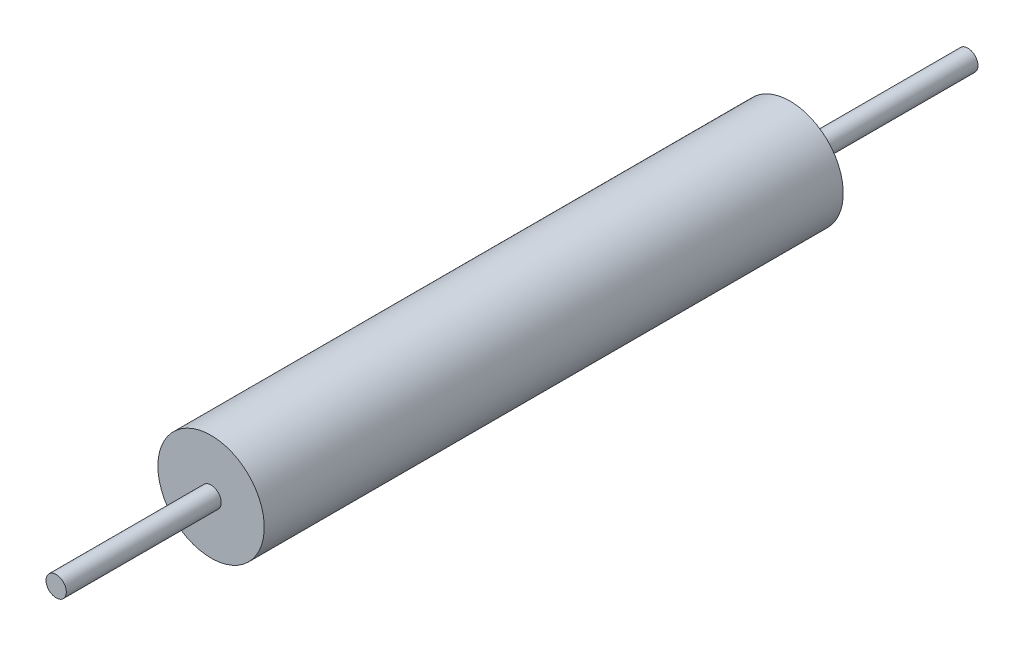
ISO-10303-21;
HEADER;
FILE_DESCRIPTION(('STEP AP214'),'2;1');
FILE_NAME('part.step','',(''),(''),'','','');
FILE_SCHEMA(('AUTOMOTIVE_DESIGN { 1 0 10303 214 1 1 1 1 }'));
ENDSEC;
DATA;
#1=APPLICATION_CONTEXT('core data for automotive mechanical design processes');
#2=APPLICATION_PROTOCOL_DEFINITION('international standard','automotive_design',2000,#1);
#3=PRODUCT_CONTEXT('',#1,'mechanical');
#4=PRODUCT('Part','Part','',(#3));
#5=PRODUCT_RELATED_PRODUCT_CATEGORY('part','',(#4));
#6=PRODUCT_DEFINITION_FORMATION('','',#4);
#7=PRODUCT_DEFINITION_CONTEXT('part definition',#1,'design');
#8=PRODUCT_DEFINITION('design','',#6,#7);
#9=PRODUCT_DEFINITION_SHAPE('','',#8);
#10=(LENGTH_UNIT() NAMED_UNIT(*) SI_UNIT(.MILLI.,.METRE.));
#11=(NAMED_UNIT(*) PLANE_ANGLE_UNIT() SI_UNIT($,.RADIAN.));
#12=(NAMED_UNIT(*) SI_UNIT($,.STERADIAN.) SOLID_ANGLE_UNIT());
#13=UNCERTAINTY_MEASURE_WITH_UNIT(LENGTH_MEASURE(1.E-05),#10,'distance_accuracy_value','');
#14=(GEOMETRIC_REPRESENTATION_CONTEXT(3) GLOBAL_UNCERTAINTY_ASSIGNED_CONTEXT((#13)) GLOBAL_UNIT_ASSIGNED_CONTEXT((#10,
#11,#12)) REPRESENTATION_CONTEXT('',''));
#15=CARTESIAN_POINT('',(0.,0.,0.));
#16=DIRECTION('',(0.,0.,1.));
#17=DIRECTION('',(1.,0.,0.));
#18=AXIS2_PLACEMENT_3D('',#15,#16,#17);
#19=CARTESIAN_POINT('',(0.,0.,228.));
#20=DIRECTION('',(0.,0.,-1.));
#21=DIRECTION('',(-1.,0.,0.));
#22=AXIS2_PLACEMENT_3D('',#19,#20,#21);
#23=CYLINDRICAL_SURFACE('',#22,20.94);
#24=CARTESIAN_POINT('',(0.,0.,228.));
#25=DIRECTION('',(0.,0.,1.));
#26=DIRECTION('',(1.,0.,0.));
#27=AXIS2_PLACEMENT_3D('',#24,#25,#26);
#28=CIRCLE('',#27,20.94);
#29=CARTESIAN_POINT('',(-20.94,0.,228.));
#30=VERTEX_POINT('',#29);
#31=EDGE_CURVE('E47',#30,#30,#28,.T.);
#32=CARTESIAN_POINT('',(0.,0.,0.));
#33=DIRECTION('',(0.,0.,1.));
#34=DIRECTION('',(1.,0.,0.));
#35=AXIS2_PLACEMENT_3D('',#32,#33,#34);
#36=CIRCLE('',#35,20.94);
#37=CARTESIAN_POINT('',(-20.94,0.,0.));
#38=VERTEX_POINT('',#37);
#39=EDGE_CURVE('E42',#38,#38,#36,.T.);
#40=CARTESIAN_POINT('',(-20.94,0.,228.));
#41=CARTESIAN_POINT('',(-20.94,0.,225.625));
#42=CARTESIAN_POINT('',(-20.94,0.,223.25));
#43=CARTESIAN_POINT('',(-20.94,0.,218.5));
#44=CARTESIAN_POINT('',(-20.94,0.,216.125));
#45=CARTESIAN_POINT('',(-20.94,0.,211.375));
#46=CARTESIAN_POINT('',(-20.94,0.,209.));
#47=CARTESIAN_POINT('',(-20.94,0.,204.25));
#48=CARTESIAN_POINT('',(-20.94,0.,201.875));
#49=CARTESIAN_POINT('',(-20.94,0.,197.125));
#50=CARTESIAN_POINT('',(-20.94,0.,194.75));
#51=CARTESIAN_POINT('',(-20.94,0.,190.));
#52=CARTESIAN_POINT('',(-20.94,0.,187.625));
#53=CARTESIAN_POINT('',(-20.94,0.,182.875));
#54=CARTESIAN_POINT('',(-20.94,0.,180.5));
#55=CARTESIAN_POINT('',(-20.94,0.,175.75));
#56=CARTESIAN_POINT('',(-20.94,0.,173.375));
#57=CARTESIAN_POINT('',(-20.94,0.,168.625));
#58=CARTESIAN_POINT('',(-20.94,0.,166.25));
#59=CARTESIAN_POINT('',(-20.94,0.,161.5));
#60=CARTESIAN_POINT('',(-20.94,0.,159.125));
#61=CARTESIAN_POINT('',(-20.94,0.,154.375));
#62=CARTESIAN_POINT('',(-20.94,0.,152.));
#63=CARTESIAN_POINT('',(-20.94,0.,147.25));
#64=CARTESIAN_POINT('',(-20.94,0.,144.875));
#65=CARTESIAN_POINT('',(-20.94,0.,140.125));
#66=CARTESIAN_POINT('',(-20.94,0.,137.75));
#67=CARTESIAN_POINT('',(-20.94,0.,133.));
#68=CARTESIAN_POINT('',(-20.94,0.,130.625));
#69=CARTESIAN_POINT('',(-20.94,0.,125.875));
#70=CARTESIAN_POINT('',(-20.94,0.,123.5));
#71=CARTESIAN_POINT('',(-20.94,0.,118.75));
#72=CARTESIAN_POINT('',(-20.94,0.,116.375));
#73=CARTESIAN_POINT('',(-20.94,0.,111.625));
#74=CARTESIAN_POINT('',(-20.94,0.,109.25));
#75=CARTESIAN_POINT('',(-20.94,0.,104.5));
#76=CARTESIAN_POINT('',(-20.94,0.,102.125));
#77=CARTESIAN_POINT('',(-20.94,0.,97.375));
#78=CARTESIAN_POINT('',(-20.94,0.,95.));
#79=CARTESIAN_POINT('',(-20.94,0.,90.25));
#80=CARTESIAN_POINT('',(-20.94,0.,87.875));
#81=CARTESIAN_POINT('',(-20.94,0.,83.125));
#82=CARTESIAN_POINT('',(-20.94,0.,80.75));
#83=CARTESIAN_POINT('',(-20.94,0.,76.));
#84=CARTESIAN_POINT('',(-20.94,0.,73.625));
#85=CARTESIAN_POINT('',(-20.94,0.,68.875));
#86=CARTESIAN_POINT('',(-20.94,0.,66.5));
#87=CARTESIAN_POINT('',(-20.94,0.,61.75));
#88=CARTESIAN_POINT('',(-20.94,0.,59.375));
#89=CARTESIAN_POINT('',(-20.94,0.,54.625));
#90=CARTESIAN_POINT('',(-20.94,0.,52.25));
#91=CARTESIAN_POINT('',(-20.94,0.,47.5));
#92=CARTESIAN_POINT('',(-20.94,0.,45.125));
#93=CARTESIAN_POINT('',(-20.94,0.,40.375));
#94=CARTESIAN_POINT('',(-20.94,0.,38.));
#95=CARTESIAN_POINT('',(-20.94,0.,33.25));
#96=CARTESIAN_POINT('',(-20.94,0.,30.875));
#97=CARTESIAN_POINT('',(-20.94,0.,26.125));
#98=CARTESIAN_POINT('',(-20.94,0.,23.75));
#99=CARTESIAN_POINT('',(-20.94,0.,19.));
#100=CARTESIAN_POINT('',(-20.94,0.,16.625));
#101=CARTESIAN_POINT('',(-20.94,0.,11.875));
#102=CARTESIAN_POINT('',(-20.94,0.,9.5));
#103=CARTESIAN_POINT('',(-20.94,0.,4.75));
#104=CARTESIAN_POINT('',(-20.94,0.,2.375));
#105=CARTESIAN_POINT('',(-20.94,0.,0.));
#106=B_SPLINE_CURVE_WITH_KNOTS('',3,(#40,#41,#42,#43,#44,#45,#46,#47,#48,#49,#50,#51,#52,#53,
#54,#55,#56,#57,#58,#59,#60,#61,#62,#63,#64,#65,#66,#67,#68,#69,#70,#71,#72,#73,#74,#75,#76,#77,
#78,#79,#80,#81,#82,#83,#84,#85,#86,#87,#88,#89,#90,#91,#92,#93,#94,#95,#96,#97,#98,#99,#100,
#101,#102,#103,#104,#105),.UNSPECIFIED.,.F.,.F.,(4,2,2,2,2,2,2,2,2,2,2,2,2,2,2,2,2,2,2,2,2,2,2,
2,2,2,2,2,2,2,2,2,4),(0.,7.12500000000002,14.25,21.375,28.5,35.625,42.75,49.875,57.,64.125,
71.25,78.375,85.5,92.625,99.75,106.875,114.,121.125,128.25,135.375,142.5,149.625,156.75,163.875,
171.,178.125,185.25,192.375,199.5,206.625,213.75,220.875,228.),.UNSPECIFIED.);
#107=EDGE_CURVE('BSEAM39',#30,#38,#106,.T.);
#108=ORIENTED_EDGE('',*,*,#31,.F.);
#109=ORIENTED_EDGE('',*,*,#39,.T.);
#110=ORIENTED_EDGE('',*,*,#107,.T.);
#111=ORIENTED_EDGE('',*,*,#107,.F.);
#112=EDGE_LOOP('',(#108,#110,#109,#111));
#113=FACE_BOUND('',#112,.T.);
#114=ADVANCED_FACE('F39',(#113),#23,.T.);
#115=CARTESIAN_POINT('',(0.,0.,228.));
#116=DIRECTION('',(0.,0.,1.));
#117=DIRECTION('',(1.,0.,0.));
#118=AXIS2_PLACEMENT_3D('',#115,#116,#117);
#119=PLANE('',#118);
#120=CARTESIAN_POINT('',(0.,0.,228.));
#121=DIRECTION('',(0.,0.,1.));
#122=DIRECTION('',(1.,0.,0.));
#123=AXIS2_PLACEMENT_3D('',#120,#121,#122);
#124=CIRCLE('',#123,4.);
#125=CARTESIAN_POINT('',(-4.,0.,228.));
#126=VERTEX_POINT('',#125);
#127=EDGE_CURVE('E10',#126,#126,#124,.T.);
#128=ORIENTED_EDGE('',*,*,#127,.F.);
#129=EDGE_LOOP('',(#128));
#130=FACE_BOUND('',#129,.T.);
#131=ORIENTED_EDGE('',*,*,#31,.T.);
#132=EDGE_LOOP('',(#131));
#133=FACE_BOUND('',#132,.T.);
#134=ADVANCED_FACE('F84',(#130,#133),#119,.T.);
#135=CARTESIAN_POINT('',(0.,0.,0.));
#136=DIRECTION('',(0.,0.,1.));
#137=DIRECTION('',(1.,0.,0.));
#138=AXIS2_PLACEMENT_3D('',#135,#136,#137);
#139=PLANE('',#138);
#140=CARTESIAN_POINT('',(0.,0.,0.));
#141=DIRECTION('',(0.,0.,1.));
#142=DIRECTION('',(1.,0.,0.));
#143=AXIS2_PLACEMENT_3D('',#140,#141,#142);
#144=CIRCLE('',#143,4.);
#145=CARTESIAN_POINT('',(4.,0.,0.));
#146=VERTEX_POINT('',#145);
#147=EDGE_CURVE('E60',#146,#146,#144,.T.);
#148=ORIENTED_EDGE('',*,*,#147,.T.);
#149=EDGE_LOOP('',(#148));
#150=FACE_BOUND('',#149,.T.);
#151=ORIENTED_EDGE('',*,*,#39,.F.);
#152=EDGE_LOOP('',(#151));
#153=FACE_BOUND('',#152,.T.);
#154=ADVANCED_FACE('F89',(#150,#153),#139,.F.);
#155=CARTESIAN_POINT('',(0.,0.,-70.));
#156=DIRECTION('',(0.,0.,1.));
#157=DIRECTION('',(1.,0.,0.));
#158=AXIS2_PLACEMENT_3D('',#155,#156,#157);
#159=CYLINDRICAL_SURFACE('',#158,4.);
#160=CARTESIAN_POINT('',(0.,0.,-70.));
#161=DIRECTION('',(0.,0.,1.));
#162=DIRECTION('',(1.,0.,0.));
#163=AXIS2_PLACEMENT_3D('',#160,#161,#162);
#164=CIRCLE('',#163,4.);
#165=CARTESIAN_POINT('',(4.,0.,-70.));
#166=VERTEX_POINT('',#165);
#167=EDGE_CURVE('E56',#166,#166,#164,.T.);
#168=ORIENTED_EDGE('',*,*,#167,.T.);
#169=EDGE_LOOP('',(#168));
#170=FACE_BOUND('',#169,.T.);
#171=ORIENTED_EDGE('',*,*,#147,.F.);
#172=EDGE_LOOP('',(#171));
#173=FACE_BOUND('',#172,.T.);
#174=ADVANCED_FACE('F80',(#170,#173),#159,.T.);
#175=CARTESIAN_POINT('',(0.,0.,-70.));
#176=DIRECTION('',(0.,0.,1.));
#177=DIRECTION('',(1.,0.,0.));
#178=AXIS2_PLACEMENT_3D('',#175,#176,#177);
#179=PLANE('',#178);
#180=ORIENTED_EDGE('',*,*,#167,.F.);
#181=EDGE_LOOP('',(#180));
#182=FACE_BOUND('',#181,.T.);
#183=ADVANCED_FACE('F73',(#182),#179,.F.);
#184=CARTESIAN_POINT('',(0.,0.,289.));
#185=DIRECTION('',(0.,0.,-1.));
#186=DIRECTION('',(-1.,0.,0.));
#187=AXIS2_PLACEMENT_3D('',#184,#185,#186);
#188=CYLINDRICAL_SURFACE('',#187,4.);
#189=CARTESIAN_POINT('',(0.,0.,289.));
#190=DIRECTION('',(0.,0.,1.));
#191=DIRECTION('',(1.,0.,0.));
#192=AXIS2_PLACEMENT_3D('',#189,#190,#191);
#193=CIRCLE('',#192,4.);
#194=CARTESIAN_POINT('',(-4.,0.,289.));
#195=VERTEX_POINT('',#194);
#196=EDGE_CURVE('E55',#195,#195,#193,.T.);
#197=CARTESIAN_POINT('',(-4.,0.,289.));
#198=CARTESIAN_POINT('',(-4.,0.,288.364583333333));
#199=CARTESIAN_POINT('',(-4.,0.,287.729166666667));
#200=CARTESIAN_POINT('',(-4.,0.,286.458333333333));
#201=CARTESIAN_POINT('',(-4.,0.,285.822916666667));
#202=CARTESIAN_POINT('',(-4.,0.,284.552083333333));
#203=CARTESIAN_POINT('',(-4.,0.,283.916666666667));
#204=CARTESIAN_POINT('',(-4.,0.,282.645833333333));
#205=CARTESIAN_POINT('',(-4.,0.,282.010416666667));
#206=CARTESIAN_POINT('',(-4.,0.,280.739583333333));
#207=CARTESIAN_POINT('',(-4.,0.,280.104166666667));
#208=CARTESIAN_POINT('',(-4.,0.,278.833333333333));
#209=CARTESIAN_POINT('',(-4.,0.,278.197916666667));
#210=CARTESIAN_POINT('',(-4.,0.,276.927083333333));
#211=CARTESIAN_POINT('',(-4.,0.,276.291666666667));
#212=CARTESIAN_POINT('',(-4.,0.,275.020833333333));
#213=CARTESIAN_POINT('',(-4.,0.,274.385416666667));
#214=CARTESIAN_POINT('',(-4.,0.,273.114583333333));
#215=CARTESIAN_POINT('',(-4.,0.,272.479166666667));
#216=CARTESIAN_POINT('',(-4.,0.,271.208333333333));
#217=CARTESIAN_POINT('',(-4.,0.,270.572916666667));
#218=CARTESIAN_POINT('',(-4.,0.,269.302083333333));
#219=CARTESIAN_POINT('',(-4.,0.,268.666666666667));
#220=CARTESIAN_POINT('',(-4.,0.,267.395833333333));
#221=CARTESIAN_POINT('',(-4.,0.,266.760416666667));
#222=CARTESIAN_POINT('',(-4.,0.,265.489583333333));
#223=CARTESIAN_POINT('',(-4.,0.,264.854166666667));
#224=CARTESIAN_POINT('',(-4.,0.,263.583333333333));
#225=CARTESIAN_POINT('',(-4.,0.,262.947916666667));
#226=CARTESIAN_POINT('',(-4.,0.,261.677083333333));
#227=CARTESIAN_POINT('',(-4.,0.,261.041666666667));
#228=CARTESIAN_POINT('',(-4.,0.,259.770833333333));
#229=CARTESIAN_POINT('',(-4.,0.,259.135416666667));
#230=CARTESIAN_POINT('',(-4.,0.,257.864583333333));
#231=CARTESIAN_POINT('',(-4.,0.,257.229166666667));
#232=CARTESIAN_POINT('',(-4.,0.,255.958333333333));
#233=CARTESIAN_POINT('',(-4.,0.,255.322916666667));
#234=CARTESIAN_POINT('',(-4.,0.,254.052083333333));
#235=CARTESIAN_POINT('',(-4.,0.,253.416666666667));
#236=CARTESIAN_POINT('',(-4.,0.,252.145833333333));
#237=CARTESIAN_POINT('',(-4.,0.,251.510416666667));
#238=CARTESIAN_POINT('',(-4.,0.,250.239583333333));
#239=CARTESIAN_POINT('',(-4.,0.,249.604166666667));
#240=CARTESIAN_POINT('',(-4.,0.,248.333333333333));
#241=CARTESIAN_POINT('',(-4.,0.,247.697916666667));
#242=CARTESIAN_POINT('',(-4.,0.,246.427083333333));
#243=CARTESIAN_POINT('',(-4.,0.,245.791666666667));
#244=CARTESIAN_POINT('',(-4.,0.,244.520833333333));
#245=CARTESIAN_POINT('',(-4.,0.,243.885416666667));
#246=CARTESIAN_POINT('',(-4.,0.,242.614583333333));
#247=CARTESIAN_POINT('',(-4.,0.,241.979166666667));
#248=CARTESIAN_POINT('',(-4.,0.,240.708333333333));
#249=CARTESIAN_POINT('',(-4.,0.,240.072916666667));
#250=CARTESIAN_POINT('',(-4.,0.,238.802083333333));
#251=CARTESIAN_POINT('',(-4.,0.,238.166666666667));
#252=CARTESIAN_POINT('',(-4.,0.,236.895833333333));
#253=CARTESIAN_POINT('',(-4.,0.,236.260416666667));
#254=CARTESIAN_POINT('',(-4.,0.,234.989583333333));
#255=CARTESIAN_POINT('',(-4.,0.,234.354166666667));
#256=CARTESIAN_POINT('',(-4.,0.,233.083333333333));
#257=CARTESIAN_POINT('',(-4.,0.,232.447916666667));
#258=CARTESIAN_POINT('',(-4.,0.,231.177083333333));
#259=CARTESIAN_POINT('',(-4.,0.,230.541666666667));
#260=CARTESIAN_POINT('',(-4.,0.,229.270833333333));
#261=CARTESIAN_POINT('',(-4.,0.,228.635416666667));
#262=CARTESIAN_POINT('',(-4.,0.,228.));
#263=B_SPLINE_CURVE_WITH_KNOTS('',3,(#197,#198,#199,#200,#201,#202,#203,#204,#205,#206,#207,
#208,#209,#210,#211,#212,#213,#214,#215,#216,#217,#218,#219,#220,#221,#222,#223,#224,#225,#226,
#227,#228,#229,#230,#231,#232,#233,#234,#235,#236,#237,#238,#239,#240,#241,#242,#243,#244,#245,
#246,#247,#248,#249,#250,#251,#252,#253,#254,#255,#256,#257,#258,#259,#260,#261,#262),
.UNSPECIFIED.,.F.,.F.,(4,2,2,2,2,2,2,2,2,2,2,2,2,2,2,2,2,2,2,2,2,2,2,2,2,2,2,2,2,2,2,2,4),(0.,
1.90625000000005,3.81250000000005,5.71875000000005,7.62500000000005,9.53125000000005,11.4375,
13.34375,15.25,17.15625,19.0625,20.96875,22.875,24.78125,26.6875,28.59375,30.5,32.40625,34.3125,
36.21875,38.125,40.03125,41.9375,43.84375,45.75,47.65625,49.5625,51.46875,53.375,55.28125,
57.1875,59.09375,61.),.UNSPECIFIED.);
#264=EDGE_CURVE('BSEAM71',#195,#126,#263,.T.);
#265=ORIENTED_EDGE('',*,*,#196,.F.);
#266=ORIENTED_EDGE('',*,*,#127,.T.);
#267=ORIENTED_EDGE('',*,*,#264,.T.);
#268=ORIENTED_EDGE('',*,*,#264,.F.);
#269=EDGE_LOOP('',(#265,#267,#266,#268));
#270=FACE_BOUND('',#269,.T.);
#271=ADVANCED_FACE('F71',(#270),#188,.T.);
#272=CARTESIAN_POINT('',(0.,0.,289.));
#273=DIRECTION('',(0.,0.,1.));
#274=DIRECTION('',(1.,0.,0.));
#275=AXIS2_PLACEMENT_3D('',#272,#273,#274);
#276=PLANE('',#275);
#277=ORIENTED_EDGE('',*,*,#196,.T.);
#278=EDGE_LOOP('',(#277));
#279=FACE_BOUND('',#278,.T.);
#280=ADVANCED_FACE('F69',(#279),#276,.T.);
#281=CLOSED_SHELL('',(#114,#134,#154,#174,#183,#271,#280));
#282=MANIFOLD_SOLID_BREP('B2',#281);
#283=ADVANCED_BREP_SHAPE_REPRESENTATION('',(#18,#282),#14);
#284=SHAPE_DEFINITION_REPRESENTATION(#9,#283);
ENDSEC;
END-ISO-10303-21;
